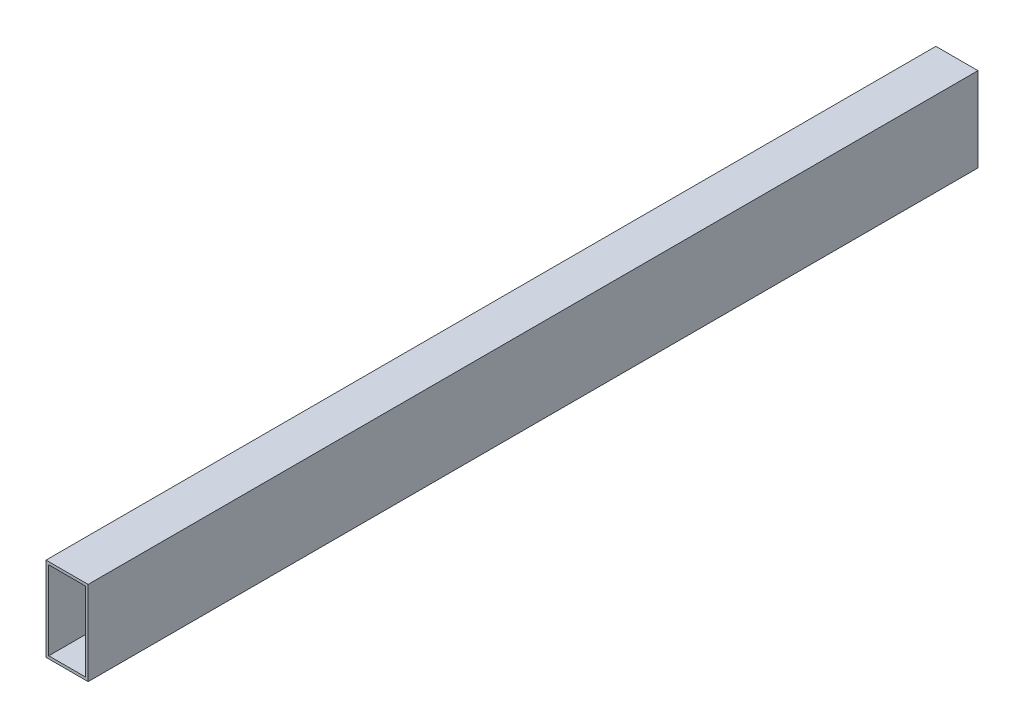
ISO-10303-21;
HEADER;
FILE_DESCRIPTION(('STEP AP214'),'2;1');
FILE_NAME('part.step','',(''),(''),'','','');
FILE_SCHEMA(('AUTOMOTIVE_DESIGN { 1 0 10303 214 1 1 1 1 }'));
ENDSEC;
DATA;
#1=APPLICATION_CONTEXT('core data for automotive mechanical design processes');
#2=APPLICATION_PROTOCOL_DEFINITION('international standard','automotive_design',2000,#1);
#3=PRODUCT_CONTEXT('',#1,'mechanical');
#4=PRODUCT('Part','Part','',(#3));
#5=PRODUCT_RELATED_PRODUCT_CATEGORY('part','',(#4));
#6=PRODUCT_DEFINITION_FORMATION('','',#4);
#7=PRODUCT_DEFINITION_CONTEXT('part definition',#1,'design');
#8=PRODUCT_DEFINITION('design','',#6,#7);
#9=PRODUCT_DEFINITION_SHAPE('','',#8);
#10=(LENGTH_UNIT() NAMED_UNIT(*) SI_UNIT(.MILLI.,.METRE.));
#11=(NAMED_UNIT(*) PLANE_ANGLE_UNIT() SI_UNIT($,.RADIAN.));
#12=(NAMED_UNIT(*) SI_UNIT($,.STERADIAN.) SOLID_ANGLE_UNIT());
#13=UNCERTAINTY_MEASURE_WITH_UNIT(LENGTH_MEASURE(1.E-05),#10,'distance_accuracy_value','');
#14=(GEOMETRIC_REPRESENTATION_CONTEXT(3) GLOBAL_UNCERTAINTY_ASSIGNED_CONTEXT((#13)) GLOBAL_UNIT_ASSIGNED_CONTEXT((#10,
#11,#12)) REPRESENTATION_CONTEXT('',''));
#15=CARTESIAN_POINT('',(0.,0.,0.));
#16=DIRECTION('',(0.,0.,1.));
#17=DIRECTION('',(1.,0.,0.));
#18=AXIS2_PLACEMENT_3D('',#15,#16,#17);
#19=CARTESIAN_POINT('',(-48.4372093023255,-30.1994186046511,536.575));
#20=DIRECTION('',(1.,0.,0.));
#21=DIRECTION('',(0.,0.,-1.));
#22=AXIS2_PLACEMENT_3D('',#19,#20,#21);
#23=PLANE('',#22);
#24=DIRECTION('',(0.,-1.,0.));
#25=VECTOR('',#24,1.);
#26=CARTESIAN_POINT('',(-48.4372093023255,-30.1994186046511,0.));
#27=LINE('',#26,#25);
#28=CARTESIAN_POINT('',(-48.4372093023255,20.6005813953489,0.));
#29=VERTEX_POINT('',#28);
#30=CARTESIAN_POINT('',(-48.4372093023255,-30.1994186046511,0.));
#31=VERTEX_POINT('',#30);
#32=EDGE_CURVE('E129',#29,#31,#27,.T.);
#33=ORIENTED_EDGE('',*,*,#32,.T.);
#34=DIRECTION('',(0.,0.,-1.));
#35=VECTOR('',#34,1.);
#36=CARTESIAN_POINT('',(-48.4372093023255,-30.1994186046511,536.575));
#37=LINE('',#36,#35);
#38=CARTESIAN_POINT('',(-48.4372093023255,-30.1994186046511,536.575));
#39=VERTEX_POINT('',#38);
#40=EDGE_CURVE('E11',#39,#31,#37,.T.);
#41=ORIENTED_EDGE('',*,*,#40,.F.);
#42=DIRECTION('',(0.,-1.,0.));
#43=VECTOR('',#42,1.);
#44=CARTESIAN_POINT('',(-48.4372093023255,-30.1994186046511,536.575));
#45=LINE('',#44,#43);
#46=CARTESIAN_POINT('',(-48.4372093023255,20.6005813953489,536.575));
#47=VERTEX_POINT('',#46);
#48=EDGE_CURVE('E133',#47,#39,#45,.T.);
#49=ORIENTED_EDGE('',*,*,#48,.F.);
#50=DIRECTION('',(0.,0.,-1.));
#51=VECTOR('',#50,1.);
#52=CARTESIAN_POINT('',(-48.4372093023255,20.6005813953489,536.575));
#53=LINE('',#52,#51);
#54=EDGE_CURVE('E143',#47,#29,#53,.T.);
#55=ORIENTED_EDGE('',*,*,#54,.T.);
#56=EDGE_LOOP('',(#33,#41,#49,#55));
#57=FACE_BOUND('',#56,.T.);
#58=ADVANCED_FACE('F32',(#57),#23,.F.);
#59=CARTESIAN_POINT('',(-48.4372093023255,-30.1994186046511,536.575));
#60=DIRECTION('',(0.,1.,0.));
#61=DIRECTION('',(0.,0.,1.));
#62=AXIS2_PLACEMENT_3D('',#59,#60,#61);
#63=PLANE('',#62);
#64=DIRECTION('',(1.,0.,0.));
#65=VECTOR('',#64,1.);
#66=CARTESIAN_POINT('',(-48.4372093023255,-30.1994186046511,0.));
#67=LINE('',#66,#65);
#68=CARTESIAN_POINT('',(-23.0372093023255,-30.1994186046511,0.));
#69=VERTEX_POINT('',#68);
#70=EDGE_CURVE('E146',#31,#69,#67,.T.);
#71=ORIENTED_EDGE('',*,*,#70,.T.);
#72=DIRECTION('',(0.,0.,-1.));
#73=VECTOR('',#72,1.);
#74=CARTESIAN_POINT('',(-23.0372093023255,-30.1994186046511,536.575));
#75=LINE('',#74,#73);
#76=CARTESIAN_POINT('',(-23.0372093023255,-30.1994186046511,536.575));
#77=VERTEX_POINT('',#76);
#78=EDGE_CURVE('E39',#77,#69,#75,.T.);
#79=ORIENTED_EDGE('',*,*,#78,.F.);
#80=DIRECTION('',(1.,0.,0.));
#81=VECTOR('',#80,1.);
#82=CARTESIAN_POINT('',(-48.4372093023255,-30.1994186046511,536.575));
#83=LINE('',#82,#81);
#84=EDGE_CURVE('E136',#39,#77,#83,.T.);
#85=ORIENTED_EDGE('',*,*,#84,.F.);
#86=ORIENTED_EDGE('',*,*,#40,.T.);
#87=EDGE_LOOP('',(#71,#79,#85,#86));
#88=FACE_BOUND('',#87,.T.);
#89=ADVANCED_FACE('F174',(#88),#63,.F.);
#90=CARTESIAN_POINT('',(-23.0372093023255,-30.1994186046511,536.575));
#91=DIRECTION('',(-1.,0.,0.));
#92=DIRECTION('',(0.,-1.,0.));
#93=AXIS2_PLACEMENT_3D('',#90,#91,#92);
#94=PLANE('',#93);
#95=DIRECTION('',(0.,1.,0.));
#96=VECTOR('',#95,1.);
#97=CARTESIAN_POINT('',(-23.0372093023255,-30.1994186046511,0.));
#98=LINE('',#97,#96);
#99=CARTESIAN_POINT('',(-23.0372093023255,20.6005813953489,0.));
#100=VERTEX_POINT('',#99);
#101=EDGE_CURVE('E148',#69,#100,#98,.T.);
#102=ORIENTED_EDGE('',*,*,#101,.T.);
#103=DIRECTION('',(0.,0.,-1.));
#104=VECTOR('',#103,1.);
#105=CARTESIAN_POINT('',(-23.0372093023255,20.6005813953489,536.575));
#106=LINE('',#105,#104);
#107=CARTESIAN_POINT('',(-23.0372093023255,20.6005813953489,536.575));
#108=VERTEX_POINT('',#107);
#109=EDGE_CURVE('E153',#108,#100,#106,.T.);
#110=ORIENTED_EDGE('',*,*,#109,.F.);
#111=DIRECTION('',(0.,1.,0.));
#112=VECTOR('',#111,1.);
#113=CARTESIAN_POINT('',(-23.0372093023255,-30.1994186046511,536.575));
#114=LINE('',#113,#112);
#115=EDGE_CURVE('E139',#77,#108,#114,.T.);
#116=ORIENTED_EDGE('',*,*,#115,.F.);
#117=ORIENTED_EDGE('',*,*,#78,.T.);
#118=EDGE_LOOP('',(#102,#110,#116,#117));
#119=FACE_BOUND('',#118,.T.);
#120=ADVANCED_FACE('F160',(#119),#94,.F.);
#121=CARTESIAN_POINT('',(-48.4372093023255,20.6005813953489,536.575));
#122=DIRECTION('',(0.,-1.,0.));
#123=DIRECTION('',(0.,0.,-1.));
#124=AXIS2_PLACEMENT_3D('',#121,#122,#123);
#125=PLANE('',#124);
#126=DIRECTION('',(-1.,0.,0.));
#127=VECTOR('',#126,1.);
#128=CARTESIAN_POINT('',(-48.4372093023255,20.6005813953489,0.));
#129=LINE('',#128,#127);
#130=EDGE_CURVE('E137',#100,#29,#129,.T.);
#131=ORIENTED_EDGE('',*,*,#130,.T.);
#132=ORIENTED_EDGE('',*,*,#54,.F.);
#133=DIRECTION('',(-1.,0.,0.));
#134=VECTOR('',#133,1.);
#135=CARTESIAN_POINT('',(-48.4372093023255,20.6005813953489,536.575));
#136=LINE('',#135,#134);
#137=EDGE_CURVE('E141',#108,#47,#136,.T.);
#138=ORIENTED_EDGE('',*,*,#137,.F.);
#139=ORIENTED_EDGE('',*,*,#109,.T.);
#140=EDGE_LOOP('',(#131,#132,#138,#139));
#141=FACE_BOUND('',#140,.T.);
#142=ADVANCED_FACE('F167',(#141),#125,.F.);
#143=CARTESIAN_POINT('',(0.,0.,536.575));
#144=DIRECTION('',(0.,0.,-1.));
#145=DIRECTION('',(-1.,0.,0.));
#146=AXIS2_PLACEMENT_3D('',#143,#144,#145);
#147=PLANE('',#146);
#148=DIRECTION('',(-1.,0.,0.));
#149=VECTOR('',#148,1.);
#150=CARTESIAN_POINT('',(-46.7862093023255,18.9495813953489,536.575));
#151=LINE('',#150,#149);
#152=CARTESIAN_POINT('',(-24.6882093023255,18.9495813953489,536.575));
#153=VERTEX_POINT('',#152);
#154=CARTESIAN_POINT('',(-46.7862093023255,18.9495813953489,536.575));
#155=VERTEX_POINT('',#154);
#156=EDGE_CURVE('E123',#153,#155,#151,.T.);
#157=ORIENTED_EDGE('',*,*,#156,.F.);
#158=DIRECTION('',(0.,1.,0.));
#159=VECTOR('',#158,1.);
#160=CARTESIAN_POINT('',(-24.6882093023255,18.9495813953489,536.575));
#161=LINE('',#160,#159);
#162=CARTESIAN_POINT('',(-24.6882093023255,-28.5484186046511,536.575));
#163=VERTEX_POINT('',#162);
#164=EDGE_CURVE('E46',#163,#153,#161,.T.);
#165=ORIENTED_EDGE('',*,*,#164,.F.);
#166=DIRECTION('',(1.,0.,0.));
#167=VECTOR('',#166,1.);
#168=CARTESIAN_POINT('',(-46.7862093023255,-28.5484186046511,536.575));
#169=LINE('',#168,#167);
#170=CARTESIAN_POINT('',(-46.7862093023255,-28.5484186046511,536.575));
#171=VERTEX_POINT('',#170);
#172=EDGE_CURVE('E114',#171,#163,#169,.T.);
#173=ORIENTED_EDGE('',*,*,#172,.F.);
#174=DIRECTION('',(0.,-1.,0.));
#175=VECTOR('',#174,1.);
#176=CARTESIAN_POINT('',(-46.7862093023255,18.9495813953489,536.575));
#177=LINE('',#176,#175);
#178=EDGE_CURVE('E117',#155,#171,#177,.T.);
#179=ORIENTED_EDGE('',*,*,#178,.F.);
#180=EDGE_LOOP('',(#157,#165,#173,#179));
#181=FACE_BOUND('',#180,.T.);
#182=ORIENTED_EDGE('',*,*,#48,.T.);
#183=ORIENTED_EDGE('',*,*,#84,.T.);
#184=ORIENTED_EDGE('',*,*,#115,.T.);
#185=ORIENTED_EDGE('',*,*,#137,.T.);
#186=EDGE_LOOP('',(#182,#183,#184,#185));
#187=FACE_BOUND('',#186,.T.);
#188=ADVANCED_FACE('F173',(#181,#187),#147,.F.);
#189=CARTESIAN_POINT('',(0.,0.,0.));
#190=DIRECTION('',(0.,0.,-1.));
#191=DIRECTION('',(-1.,0.,0.));
#192=AXIS2_PLACEMENT_3D('',#189,#190,#191);
#193=PLANE('',#192);
#194=DIRECTION('',(0.,1.,0.));
#195=VECTOR('',#194,1.);
#196=CARTESIAN_POINT('',(-24.6882093023255,18.9495813953489,0.));
#197=LINE('',#196,#195);
#198=CARTESIAN_POINT('',(-24.6882093023255,-28.5484186046511,0.));
#199=VERTEX_POINT('',#198);
#200=CARTESIAN_POINT('',(-24.6882093023255,18.9495813953489,0.));
#201=VERTEX_POINT('',#200);
#202=EDGE_CURVE('E98',#199,#201,#197,.T.);
#203=ORIENTED_EDGE('',*,*,#202,.T.);
#204=DIRECTION('',(-1.,0.,0.));
#205=VECTOR('',#204,1.);
#206=CARTESIAN_POINT('',(-46.7862093023255,18.9495813953489,0.));
#207=LINE('',#206,#205);
#208=CARTESIAN_POINT('',(-46.7862093023255,18.9495813953489,0.));
#209=VERTEX_POINT('',#208);
#210=EDGE_CURVE('E107',#201,#209,#207,.T.);
#211=ORIENTED_EDGE('',*,*,#210,.T.);
#212=DIRECTION('',(0.,-1.,0.));
#213=VECTOR('',#212,1.);
#214=CARTESIAN_POINT('',(-46.7862093023255,18.9495813953489,0.));
#215=LINE('',#214,#213);
#216=CARTESIAN_POINT('',(-46.7862093023255,-28.5484186046511,0.));
#217=VERTEX_POINT('',#216);
#218=EDGE_CURVE('E54',#209,#217,#215,.T.);
#219=ORIENTED_EDGE('',*,*,#218,.T.);
#220=DIRECTION('',(1.,0.,0.));
#221=VECTOR('',#220,1.);
#222=CARTESIAN_POINT('',(-46.7862093023255,-28.5484186046511,0.));
#223=LINE('',#222,#221);
#224=EDGE_CURVE('E104',#217,#199,#223,.T.);
#225=ORIENTED_EDGE('',*,*,#224,.T.);
#226=EDGE_LOOP('',(#203,#211,#219,#225));
#227=FACE_BOUND('',#226,.T.);
#228=ORIENTED_EDGE('',*,*,#32,.F.);
#229=ORIENTED_EDGE('',*,*,#130,.F.);
#230=ORIENTED_EDGE('',*,*,#101,.F.);
#231=ORIENTED_EDGE('',*,*,#70,.F.);
#232=EDGE_LOOP('',(#228,#229,#230,#231));
#233=FACE_BOUND('',#232,.T.);
#234=ADVANCED_FACE('F111',(#227,#233),#193,.T.);
#235=CARTESIAN_POINT('',(-24.6882093023255,18.9495813953489,0.));
#236=DIRECTION('',(1.,0.,0.));
#237=DIRECTION('',(0.,1.,0.));
#238=AXIS2_PLACEMENT_3D('',#235,#236,#237);
#239=PLANE('',#238);
#240=ORIENTED_EDGE('',*,*,#164,.T.);
#241=DIRECTION('',(0.,0.,1.));
#242=VECTOR('',#241,1.);
#243=CARTESIAN_POINT('',(-24.6882093023255,18.9495813953489,0.));
#244=LINE('',#243,#242);
#245=EDGE_CURVE('E94',#201,#153,#244,.T.);
#246=ORIENTED_EDGE('',*,*,#245,.F.);
#247=ORIENTED_EDGE('',*,*,#202,.F.);
#248=DIRECTION('',(0.,0.,1.));
#249=VECTOR('',#248,1.);
#250=CARTESIAN_POINT('',(-24.6882093023255,-28.5484186046511,0.));
#251=LINE('',#250,#249);
#252=EDGE_CURVE('E127',#199,#163,#251,.T.);
#253=ORIENTED_EDGE('',*,*,#252,.T.);
#254=EDGE_LOOP('',(#240,#246,#247,#253));
#255=FACE_BOUND('',#254,.T.);
#256=ADVANCED_FACE('F96',(#255),#239,.F.);
#257=CARTESIAN_POINT('',(-46.7862093023255,-28.5484186046511,0.));
#258=DIRECTION('',(0.,-1.,0.));
#259=DIRECTION('',(0.,0.,-1.));
#260=AXIS2_PLACEMENT_3D('',#257,#258,#259);
#261=PLANE('',#260);
#262=ORIENTED_EDGE('',*,*,#172,.T.);
#263=ORIENTED_EDGE('',*,*,#252,.F.);
#264=ORIENTED_EDGE('',*,*,#224,.F.);
#265=DIRECTION('',(0.,0.,1.));
#266=VECTOR('',#265,1.);
#267=CARTESIAN_POINT('',(-46.7862093023255,-28.5484186046511,0.));
#268=LINE('',#267,#266);
#269=EDGE_CURVE('E130',#217,#171,#268,.T.);
#270=ORIENTED_EDGE('',*,*,#269,.T.);
#271=EDGE_LOOP('',(#262,#263,#264,#270));
#272=FACE_BOUND('',#271,.T.);
#273=ADVANCED_FACE('F191',(#272),#261,.F.);
#274=CARTESIAN_POINT('',(-46.7862093023255,18.9495813953489,0.));
#275=DIRECTION('',(-1.,0.,0.));
#276=DIRECTION('',(0.,-1.,0.));
#277=AXIS2_PLACEMENT_3D('',#274,#275,#276);
#278=PLANE('',#277);
#279=ORIENTED_EDGE('',*,*,#178,.T.);
#280=ORIENTED_EDGE('',*,*,#269,.F.);
#281=ORIENTED_EDGE('',*,*,#218,.F.);
#282=DIRECTION('',(0.,0.,1.));
#283=VECTOR('',#282,1.);
#284=CARTESIAN_POINT('',(-46.7862093023255,18.9495813953489,0.));
#285=LINE('',#284,#283);
#286=EDGE_CURVE('E103',#209,#155,#285,.T.);
#287=ORIENTED_EDGE('',*,*,#286,.T.);
#288=EDGE_LOOP('',(#279,#280,#281,#287));
#289=FACE_BOUND('',#288,.T.);
#290=ADVANCED_FACE('F194',(#289),#278,.F.);
#291=CARTESIAN_POINT('',(-46.7862093023255,18.9495813953489,0.));
#292=DIRECTION('',(0.,1.,0.));
#293=DIRECTION('',(0.,0.,1.));
#294=AXIS2_PLACEMENT_3D('',#291,#292,#293);
#295=PLANE('',#294);
#296=ORIENTED_EDGE('',*,*,#156,.T.);
#297=ORIENTED_EDGE('',*,*,#286,.F.);
#298=ORIENTED_EDGE('',*,*,#210,.F.);
#299=ORIENTED_EDGE('',*,*,#245,.T.);
#300=EDGE_LOOP('',(#296,#297,#298,#299));
#301=FACE_BOUND('',#300,.T.);
#302=ADVANCED_FACE('F108',(#301),#295,.F.);
#303=CLOSED_SHELL('',(#58,#89,#120,#142,#188,#234,#256,#273,#290,#302));
#304=MANIFOLD_SOLID_BREP('B2',#303);
#305=ADVANCED_BREP_SHAPE_REPRESENTATION('',(#18,#304),#14);
#306=SHAPE_DEFINITION_REPRESENTATION(#9,#305);
ENDSEC;
END-ISO-10303-21;
